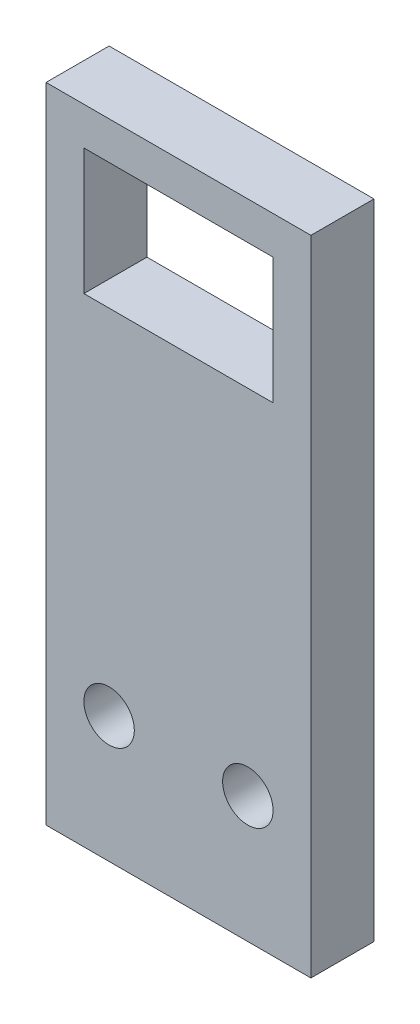
ISO-10303-21;
HEADER;
FILE_DESCRIPTION(('STEP AP214'),'2;1');
FILE_NAME('part.step','',(''),(''),'','','');
FILE_SCHEMA(('AUTOMOTIVE_DESIGN { 1 0 10303 214 1 1 1 1 }'));
ENDSEC;
DATA;
#1=APPLICATION_CONTEXT('core data for automotive mechanical design processes');
#2=APPLICATION_PROTOCOL_DEFINITION('international standard','automotive_design',2000,#1);
#3=PRODUCT_CONTEXT('',#1,'mechanical');
#4=PRODUCT('Part','Part','',(#3));
#5=PRODUCT_RELATED_PRODUCT_CATEGORY('part','',(#4));
#6=PRODUCT_DEFINITION_FORMATION('','',#4);
#7=PRODUCT_DEFINITION_CONTEXT('part definition',#1,'design');
#8=PRODUCT_DEFINITION('design','',#6,#7);
#9=PRODUCT_DEFINITION_SHAPE('','',#8);
#10=(LENGTH_UNIT() NAMED_UNIT(*) SI_UNIT(.MILLI.,.METRE.));
#11=(NAMED_UNIT(*) PLANE_ANGLE_UNIT() SI_UNIT($,.RADIAN.));
#12=(NAMED_UNIT(*) SI_UNIT($,.STERADIAN.) SOLID_ANGLE_UNIT());
#13=UNCERTAINTY_MEASURE_WITH_UNIT(LENGTH_MEASURE(1.E-05),#10,'distance_accuracy_value','');
#14=(GEOMETRIC_REPRESENTATION_CONTEXT(3) GLOBAL_UNCERTAINTY_ASSIGNED_CONTEXT((#13)) GLOBAL_UNIT_ASSIGNED_CONTEXT((#10,
#11,#12)) REPRESENTATION_CONTEXT('',''));
#15=CARTESIAN_POINT('',(0.,0.,0.));
#16=DIRECTION('',(0.,0.,1.));
#17=DIRECTION('',(1.,0.,0.));
#18=AXIS2_PLACEMENT_3D('',#15,#16,#17);
#19=CARTESIAN_POINT('',(0.,0.,5.));
#20=DIRECTION('',(0.,0.,-1.));
#21=DIRECTION('',(-1.,0.,0.));
#22=AXIS2_PLACEMENT_3D('',#19,#20,#21);
#23=PLANE('',#22);
#24=DIRECTION('',(0.,-1.,0.));
#25=VECTOR('',#24,1.);
#26=CARTESIAN_POINT('',(0.,0.,5.));
#27=LINE('',#26,#25);
#28=CARTESIAN_POINT('',(0.,51.,5.));
#29=VERTEX_POINT('',#28);
#30=CARTESIAN_POINT('',(0.,0.,5.));
#31=VERTEX_POINT('',#30);
#32=EDGE_CURVE('E145',#29,#31,#27,.T.);
#33=ORIENTED_EDGE('',*,*,#32,.T.);
#34=DIRECTION('',(1.,0.,0.));
#35=VECTOR('',#34,1.);
#36=CARTESIAN_POINT('',(0.,0.,5.));
#37=LINE('',#36,#35);
#38=CARTESIAN_POINT('',(21.,0.,5.));
#39=VERTEX_POINT('',#38);
#40=EDGE_CURVE('E148',#31,#39,#37,.T.);
#41=ORIENTED_EDGE('',*,*,#40,.T.);
#42=DIRECTION('',(0.,1.,0.));
#43=VECTOR('',#42,1.);
#44=CARTESIAN_POINT('',(21.,0.,5.));
#45=LINE('',#44,#43);
#46=CARTESIAN_POINT('',(21.,51.,5.));
#47=VERTEX_POINT('',#46);
#48=EDGE_CURVE('E151',#39,#47,#45,.T.);
#49=ORIENTED_EDGE('',*,*,#48,.T.);
#50=DIRECTION('',(-1.,0.,0.));
#51=VECTOR('',#50,1.);
#52=CARTESIAN_POINT('',(0.,51.,5.));
#53=LINE('',#52,#51);
#54=EDGE_CURVE('E153',#47,#29,#53,.T.);
#55=ORIENTED_EDGE('',*,*,#54,.T.);
#56=EDGE_LOOP('',(#33,#41,#49,#55));
#57=FACE_BOUND('',#56,.T.);
#58=DIRECTION('',(0.,-1.,0.));
#59=VECTOR('',#58,1.);
#60=CARTESIAN_POINT('',(3.,48.,5.));
#61=LINE('',#60,#59);
#62=CARTESIAN_POINT('',(3.,48.,5.));
#63=VERTEX_POINT('',#62);
#64=CARTESIAN_POINT('',(3.,38.,5.));
#65=VERTEX_POINT('',#64);
#66=EDGE_CURVE('E106',#63,#65,#61,.T.);
#67=ORIENTED_EDGE('',*,*,#66,.F.);
#68=DIRECTION('',(-1.,0.,0.));
#69=VECTOR('',#68,1.);
#70=CARTESIAN_POINT('',(3.,48.,5.));
#71=LINE('',#70,#69);
#72=CARTESIAN_POINT('',(18.,48.,5.));
#73=VERTEX_POINT('',#72);
#74=EDGE_CURVE('E129',#73,#63,#71,.T.);
#75=ORIENTED_EDGE('',*,*,#74,.F.);
#76=DIRECTION('',(0.,1.,0.));
#77=VECTOR('',#76,1.);
#78=CARTESIAN_POINT('',(18.,48.,5.));
#79=LINE('',#78,#77);
#80=CARTESIAN_POINT('',(18.,38.,5.));
#81=VERTEX_POINT('',#80);
#82=EDGE_CURVE('E127',#81,#73,#79,.T.);
#83=ORIENTED_EDGE('',*,*,#82,.F.);
#84=DIRECTION('',(1.,0.,0.));
#85=VECTOR('',#84,1.);
#86=CARTESIAN_POINT('',(3.,38.,5.));
#87=LINE('',#86,#85);
#88=EDGE_CURVE('E114',#65,#81,#87,.T.);
#89=ORIENTED_EDGE('',*,*,#88,.F.);
#90=EDGE_LOOP('',(#67,#75,#83,#89));
#91=FACE_BOUND('',#90,.T.);
#92=CARTESIAN_POINT('',(5.,10.,5.));
#93=DIRECTION('',(0.,0.,1.));
#94=DIRECTION('',(1.,0.,0.));
#95=AXIS2_PLACEMENT_3D('',#92,#93,#94);
#96=CIRCLE('',#95,2.);
#97=CARTESIAN_POINT('',(7.,10.,5.));
#98=VERTEX_POINT('',#97);
#99=EDGE_CURVE('E135',#98,#98,#96,.T.);
#100=ORIENTED_EDGE('',*,*,#99,.F.);
#101=EDGE_LOOP('',(#100));
#102=FACE_BOUND('',#101,.T.);
#103=CARTESIAN_POINT('',(16.,10.,5.));
#104=DIRECTION('',(0.,0.,1.));
#105=DIRECTION('',(1.,0.,0.));
#106=AXIS2_PLACEMENT_3D('',#103,#104,#105);
#107=CIRCLE('',#106,2.);
#108=CARTESIAN_POINT('',(18.,10.,5.));
#109=VERTEX_POINT('',#108);
#110=EDGE_CURVE('E234',#109,#109,#107,.T.);
#111=ORIENTED_EDGE('',*,*,#110,.F.);
#112=EDGE_LOOP('',(#111));
#113=FACE_BOUND('',#112,.T.);
#114=ADVANCED_FACE('F41',(#57,#91,#102,#113),#23,.F.);
#115=CARTESIAN_POINT('',(0.,0.,0.));
#116=DIRECTION('',(0.,0.,-1.));
#117=DIRECTION('',(-1.,0.,0.));
#118=AXIS2_PLACEMENT_3D('',#115,#116,#117);
#119=PLANE('',#118);
#120=CARTESIAN_POINT('',(5.,10.,0.));
#121=DIRECTION('',(0.,0.,1.));
#122=DIRECTION('',(1.,0.,0.));
#123=AXIS2_PLACEMENT_3D('',#120,#121,#122);
#124=CIRCLE('',#123,2.);
#125=CARTESIAN_POINT('',(7.,10.,0.));
#126=VERTEX_POINT('',#125);
#127=EDGE_CURVE('E240',#126,#126,#124,.T.);
#128=ORIENTED_EDGE('',*,*,#127,.T.);
#129=EDGE_LOOP('',(#128));
#130=FACE_BOUND('',#129,.T.);
#131=DIRECTION('',(0.,-1.,0.));
#132=VECTOR('',#131,1.);
#133=CARTESIAN_POINT('',(0.,0.,0.));
#134=LINE('',#133,#132);
#135=CARTESIAN_POINT('',(0.,51.,0.));
#136=VERTEX_POINT('',#135);
#137=CARTESIAN_POINT('',(0.,0.,0.));
#138=VERTEX_POINT('',#137);
#139=EDGE_CURVE('E122',#136,#138,#134,.T.);
#140=ORIENTED_EDGE('',*,*,#139,.F.);
#141=DIRECTION('',(-1.,0.,0.));
#142=VECTOR('',#141,1.);
#143=CARTESIAN_POINT('',(0.,51.,0.));
#144=LINE('',#143,#142);
#145=CARTESIAN_POINT('',(21.,51.,0.));
#146=VERTEX_POINT('',#145);
#147=EDGE_CURVE('E149',#146,#136,#144,.T.);
#148=ORIENTED_EDGE('',*,*,#147,.F.);
#149=DIRECTION('',(0.,1.,0.));
#150=VECTOR('',#149,1.);
#151=CARTESIAN_POINT('',(21.,0.,0.));
#152=LINE('',#151,#150);
#153=CARTESIAN_POINT('',(21.,0.,0.));
#154=VERTEX_POINT('',#153);
#155=EDGE_CURVE('E160',#154,#146,#152,.T.);
#156=ORIENTED_EDGE('',*,*,#155,.F.);
#157=DIRECTION('',(1.,0.,0.));
#158=VECTOR('',#157,1.);
#159=CARTESIAN_POINT('',(0.,0.,0.));
#160=LINE('',#159,#158);
#161=EDGE_CURVE('E158',#138,#154,#160,.T.);
#162=ORIENTED_EDGE('',*,*,#161,.F.);
#163=EDGE_LOOP('',(#140,#148,#156,#162));
#164=FACE_BOUND('',#163,.T.);
#165=DIRECTION('',(-1.,0.,0.));
#166=VECTOR('',#165,1.);
#167=CARTESIAN_POINT('',(3.,48.,0.));
#168=LINE('',#167,#166);
#169=CARTESIAN_POINT('',(18.,48.,0.));
#170=VERTEX_POINT('',#169);
#171=CARTESIAN_POINT('',(3.,48.,0.));
#172=VERTEX_POINT('',#171);
#173=EDGE_CURVE('E115',#170,#172,#168,.T.);
#174=ORIENTED_EDGE('',*,*,#173,.T.);
#175=DIRECTION('',(0.,-1.,0.));
#176=VECTOR('',#175,1.);
#177=CARTESIAN_POINT('',(3.,48.,0.));
#178=LINE('',#177,#176);
#179=CARTESIAN_POINT('',(3.,38.,0.));
#180=VERTEX_POINT('',#179);
#181=EDGE_CURVE('E64',#172,#180,#178,.T.);
#182=ORIENTED_EDGE('',*,*,#181,.T.);
#183=DIRECTION('',(1.,0.,0.));
#184=VECTOR('',#183,1.);
#185=CARTESIAN_POINT('',(3.,38.,0.));
#186=LINE('',#185,#184);
#187=CARTESIAN_POINT('',(18.,38.,0.));
#188=VERTEX_POINT('',#187);
#189=EDGE_CURVE('E121',#180,#188,#186,.T.);
#190=ORIENTED_EDGE('',*,*,#189,.T.);
#191=DIRECTION('',(0.,1.,0.));
#192=VECTOR('',#191,1.);
#193=CARTESIAN_POINT('',(18.,48.,0.));
#194=LINE('',#193,#192);
#195=EDGE_CURVE('E137',#188,#170,#194,.T.);
#196=ORIENTED_EDGE('',*,*,#195,.T.);
#197=EDGE_LOOP('',(#174,#182,#190,#196));
#198=FACE_BOUND('',#197,.T.);
#199=CARTESIAN_POINT('',(16.,10.,0.));
#200=DIRECTION('',(0.,0.,1.));
#201=DIRECTION('',(1.,0.,0.));
#202=AXIS2_PLACEMENT_3D('',#199,#200,#201);
#203=CIRCLE('',#202,2.);
#204=CARTESIAN_POINT('',(18.,10.,0.));
#205=VERTEX_POINT('',#204);
#206=EDGE_CURVE('E237',#205,#205,#203,.T.);
#207=ORIENTED_EDGE('',*,*,#206,.T.);
#208=EDGE_LOOP('',(#207));
#209=FACE_BOUND('',#208,.T.);
#210=ADVANCED_FACE('F178',(#130,#164,#198,#209),#119,.T.);
#211=CARTESIAN_POINT('',(0.,0.,5.));
#212=DIRECTION('',(1.,0.,0.));
#213=DIRECTION('',(0.,0.,-1.));
#214=AXIS2_PLACEMENT_3D('',#211,#212,#213);
#215=PLANE('',#214);
#216=ORIENTED_EDGE('',*,*,#139,.T.);
#217=DIRECTION('',(0.,0.,-1.));
#218=VECTOR('',#217,1.);
#219=CARTESIAN_POINT('',(0.,0.,5.));
#220=LINE('',#219,#218);
#221=EDGE_CURVE('E11',#31,#138,#220,.T.);
#222=ORIENTED_EDGE('',*,*,#221,.F.);
#223=ORIENTED_EDGE('',*,*,#32,.F.);
#224=DIRECTION('',(0.,0.,-1.));
#225=VECTOR('',#224,1.);
#226=CARTESIAN_POINT('',(0.,51.,5.));
#227=LINE('',#226,#225);
#228=EDGE_CURVE('E155',#29,#136,#227,.T.);
#229=ORIENTED_EDGE('',*,*,#228,.T.);
#230=EDGE_LOOP('',(#216,#222,#223,#229));
#231=FACE_BOUND('',#230,.T.);
#232=ADVANCED_FACE('F43',(#231),#215,.F.);
#233=CARTESIAN_POINT('',(0.,0.,5.));
#234=DIRECTION('',(0.,1.,0.));
#235=DIRECTION('',(0.,0.,1.));
#236=AXIS2_PLACEMENT_3D('',#233,#234,#235);
#237=PLANE('',#236);
#238=ORIENTED_EDGE('',*,*,#161,.T.);
#239=DIRECTION('',(0.,0.,-1.));
#240=VECTOR('',#239,1.);
#241=CARTESIAN_POINT('',(21.,0.,5.));
#242=LINE('',#241,#240);
#243=EDGE_CURVE('E49',#39,#154,#242,.T.);
#244=ORIENTED_EDGE('',*,*,#243,.F.);
#245=ORIENTED_EDGE('',*,*,#40,.F.);
#246=ORIENTED_EDGE('',*,*,#221,.T.);
#247=EDGE_LOOP('',(#238,#244,#245,#246));
#248=FACE_BOUND('',#247,.T.);
#249=ADVANCED_FACE('F188',(#248),#237,.F.);
#250=CARTESIAN_POINT('',(21.,0.,5.));
#251=DIRECTION('',(-1.,0.,0.));
#252=DIRECTION('',(0.,0.,1.));
#253=AXIS2_PLACEMENT_3D('',#250,#251,#252);
#254=PLANE('',#253);
#255=ORIENTED_EDGE('',*,*,#155,.T.);
#256=DIRECTION('',(0.,0.,-1.));
#257=VECTOR('',#256,1.);
#258=CARTESIAN_POINT('',(21.,51.,5.));
#259=LINE('',#258,#257);
#260=EDGE_CURVE('E165',#47,#146,#259,.T.);
#261=ORIENTED_EDGE('',*,*,#260,.F.);
#262=ORIENTED_EDGE('',*,*,#48,.F.);
#263=ORIENTED_EDGE('',*,*,#243,.T.);
#264=EDGE_LOOP('',(#255,#261,#262,#263));
#265=FACE_BOUND('',#264,.T.);
#266=ADVANCED_FACE('F172',(#265),#254,.F.);
#267=CARTESIAN_POINT('',(0.,51.,5.));
#268=DIRECTION('',(0.,-1.,0.));
#269=DIRECTION('',(0.,0.,-1.));
#270=AXIS2_PLACEMENT_3D('',#267,#268,#269);
#271=PLANE('',#270);
#272=ORIENTED_EDGE('',*,*,#147,.T.);
#273=ORIENTED_EDGE('',*,*,#228,.F.);
#274=ORIENTED_EDGE('',*,*,#54,.F.);
#275=ORIENTED_EDGE('',*,*,#260,.T.);
#276=EDGE_LOOP('',(#272,#273,#274,#275));
#277=FACE_BOUND('',#276,.T.);
#278=ADVANCED_FACE('F182',(#277),#271,.F.);
#279=CARTESIAN_POINT('',(3.,48.,5.));
#280=DIRECTION('',(1.,0.,0.));
#281=DIRECTION('',(0.,1.,0.));
#282=AXIS2_PLACEMENT_3D('',#279,#280,#281);
#283=PLANE('',#282);
#284=ORIENTED_EDGE('',*,*,#181,.F.);
#285=DIRECTION('',(0.,0.,-1.));
#286=VECTOR('',#285,1.);
#287=CARTESIAN_POINT('',(3.,48.,5.));
#288=LINE('',#287,#286);
#289=EDGE_CURVE('E110',#63,#172,#288,.T.);
#290=ORIENTED_EDGE('',*,*,#289,.F.);
#291=ORIENTED_EDGE('',*,*,#66,.T.);
#292=DIRECTION('',(0.,0.,-1.));
#293=VECTOR('',#292,1.);
#294=CARTESIAN_POINT('',(3.,38.,5.));
#295=LINE('',#294,#293);
#296=EDGE_CURVE('E109',#65,#180,#295,.T.);
#297=ORIENTED_EDGE('',*,*,#296,.T.);
#298=EDGE_LOOP('',(#284,#290,#291,#297));
#299=FACE_BOUND('',#298,.T.);
#300=ADVANCED_FACE('F108',(#299),#283,.T.);
#301=CARTESIAN_POINT('',(3.,38.,5.));
#302=DIRECTION('',(0.,1.,0.));
#303=DIRECTION('',(0.,0.,1.));
#304=AXIS2_PLACEMENT_3D('',#301,#302,#303);
#305=PLANE('',#304);
#306=ORIENTED_EDGE('',*,*,#189,.F.);
#307=ORIENTED_EDGE('',*,*,#296,.F.);
#308=ORIENTED_EDGE('',*,*,#88,.T.);
#309=DIRECTION('',(0.,0.,-1.));
#310=VECTOR('',#309,1.);
#311=CARTESIAN_POINT('',(18.,38.,5.));
#312=LINE('',#311,#310);
#313=EDGE_CURVE('E123',#81,#188,#312,.T.);
#314=ORIENTED_EDGE('',*,*,#313,.T.);
#315=EDGE_LOOP('',(#306,#307,#308,#314));
#316=FACE_BOUND('',#315,.T.);
#317=ADVANCED_FACE('F118',(#316),#305,.T.);
#318=CARTESIAN_POINT('',(18.,48.,5.));
#319=DIRECTION('',(-1.,0.,0.));
#320=DIRECTION('',(0.,-1.,0.));
#321=AXIS2_PLACEMENT_3D('',#318,#319,#320);
#322=PLANE('',#321);
#323=ORIENTED_EDGE('',*,*,#195,.F.);
#324=ORIENTED_EDGE('',*,*,#313,.F.);
#325=ORIENTED_EDGE('',*,*,#82,.T.);
#326=DIRECTION('',(0.,0.,-1.));
#327=VECTOR('',#326,1.);
#328=CARTESIAN_POINT('',(18.,48.,5.));
#329=LINE('',#328,#327);
#330=EDGE_CURVE('E56',#73,#170,#329,.T.);
#331=ORIENTED_EDGE('',*,*,#330,.T.);
#332=EDGE_LOOP('',(#323,#324,#325,#331));
#333=FACE_BOUND('',#332,.T.);
#334=ADVANCED_FACE('F212',(#333),#322,.T.);
#335=CARTESIAN_POINT('',(3.,48.,5.));
#336=DIRECTION('',(0.,-1.,0.));
#337=DIRECTION('',(1.,0.,0.));
#338=AXIS2_PLACEMENT_3D('',#335,#336,#337);
#339=PLANE('',#338);
#340=ORIENTED_EDGE('',*,*,#173,.F.);
#341=ORIENTED_EDGE('',*,*,#330,.F.);
#342=ORIENTED_EDGE('',*,*,#74,.T.);
#343=ORIENTED_EDGE('',*,*,#289,.T.);
#344=EDGE_LOOP('',(#340,#341,#342,#343));
#345=FACE_BOUND('',#344,.T.);
#346=ADVANCED_FACE('F216',(#345),#339,.T.);
#347=CARTESIAN_POINT('',(5.,10.,5.));
#348=DIRECTION('',(0.,0.,-1.));
#349=DIRECTION('',(-1.,0.,0.));
#350=AXIS2_PLACEMENT_3D('',#347,#348,#349);
#351=CYLINDRICAL_SURFACE('',#350,2.);
#352=ORIENTED_EDGE('',*,*,#99,.T.);
#353=EDGE_LOOP('',(#352));
#354=FACE_BOUND('',#353,.T.);
#355=ORIENTED_EDGE('',*,*,#127,.F.);
#356=EDGE_LOOP('',(#355));
#357=FACE_BOUND('',#356,.T.);
#358=ADVANCED_FACE('F222',(#354,#357),#351,.F.);
#359=CARTESIAN_POINT('',(16.,10.,5.));
#360=DIRECTION('',(0.,0.,-1.));
#361=DIRECTION('',(-1.,0.,0.));
#362=AXIS2_PLACEMENT_3D('',#359,#360,#361);
#363=CYLINDRICAL_SURFACE('',#362,2.);
#364=ORIENTED_EDGE('',*,*,#110,.T.);
#365=EDGE_LOOP('',(#364));
#366=FACE_BOUND('',#365,.T.);
#367=ORIENTED_EDGE('',*,*,#206,.F.);
#368=EDGE_LOOP('',(#367));
#369=FACE_BOUND('',#368,.T.);
#370=ADVANCED_FACE('F225',(#366,#369),#363,.F.);
#371=CLOSED_SHELL('',(#114,#210,#232,#249,#266,#278,#300,#317,#334,#346,#358,#370));
#372=MANIFOLD_SOLID_BREP('B2',#371);
#373=ADVANCED_BREP_SHAPE_REPRESENTATION('',(#18,#372),#14);
#374=SHAPE_DEFINITION_REPRESENTATION(#9,#373);
ENDSEC;
END-ISO-10303-21;
